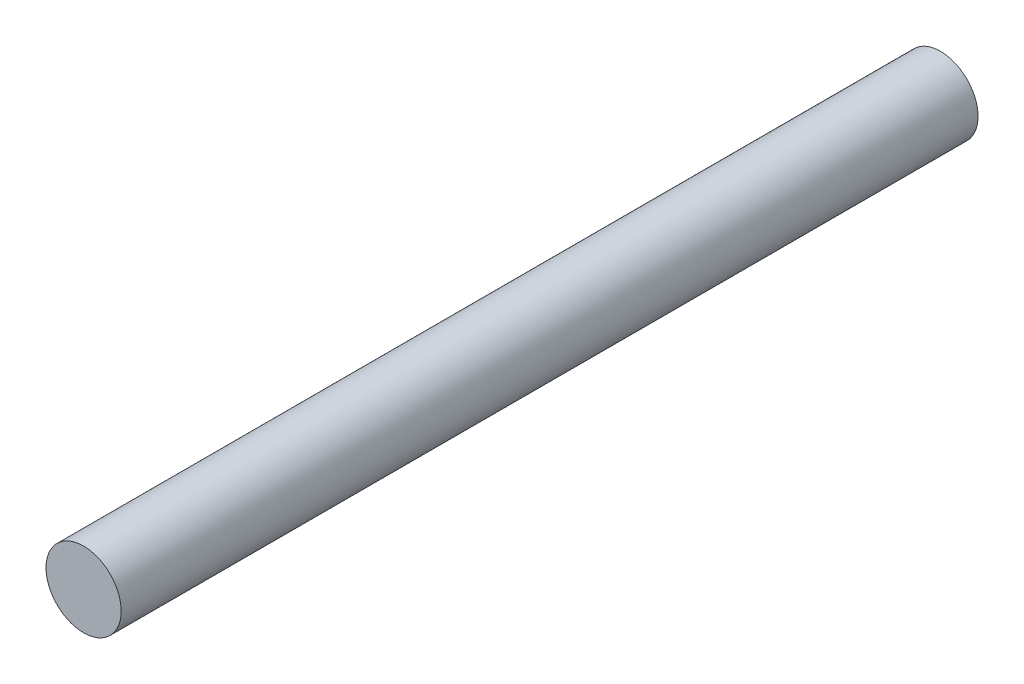
ISO-10303-21;
HEADER;
FILE_DESCRIPTION(('STEP AP214'),'2;1');
FILE_NAME('part.step','',(''),(''),'','','');
FILE_SCHEMA(('AUTOMOTIVE_DESIGN { 1 0 10303 214 1 1 1 1 }'));
ENDSEC;
DATA;
#1=APPLICATION_CONTEXT('core data for automotive mechanical design processes');
#2=APPLICATION_PROTOCOL_DEFINITION('international standard','automotive_design',2000,#1);
#3=PRODUCT_CONTEXT('',#1,'mechanical');
#4=PRODUCT('Part','Part','',(#3));
#5=PRODUCT_RELATED_PRODUCT_CATEGORY('part','',(#4));
#6=PRODUCT_DEFINITION_FORMATION('','',#4);
#7=PRODUCT_DEFINITION_CONTEXT('part definition',#1,'design');
#8=PRODUCT_DEFINITION('design','',#6,#7);
#9=PRODUCT_DEFINITION_SHAPE('','',#8);
#10=(LENGTH_UNIT() NAMED_UNIT(*) SI_UNIT(.MILLI.,.METRE.));
#11=(NAMED_UNIT(*) PLANE_ANGLE_UNIT() SI_UNIT($,.RADIAN.));
#12=(NAMED_UNIT(*) SI_UNIT($,.STERADIAN.) SOLID_ANGLE_UNIT());
#13=UNCERTAINTY_MEASURE_WITH_UNIT(LENGTH_MEASURE(1.E-05),#10,'distance_accuracy_value','');
#14=(GEOMETRIC_REPRESENTATION_CONTEXT(3) GLOBAL_UNCERTAINTY_ASSIGNED_CONTEXT((#13)) GLOBAL_UNIT_ASSIGNED_CONTEXT((#10,
#11,#12)) REPRESENTATION_CONTEXT('',''));
#15=CARTESIAN_POINT('',(0.,0.,0.));
#16=DIRECTION('',(0.,0.,1.));
#17=DIRECTION('',(1.,0.,0.));
#18=AXIS2_PLACEMENT_3D('',#15,#16,#17);
#19=CARTESIAN_POINT('',(0.,0.,57.));
#20=DIRECTION('',(0.,0.,-1.));
#21=DIRECTION('',(-1.,0.,0.));
#22=AXIS2_PLACEMENT_3D('',#19,#20,#21);
#23=CYLINDRICAL_SURFACE('',#22,2.5);
#24=CARTESIAN_POINT('',(0.,0.,57.));
#25=DIRECTION('',(0.,0.,1.));
#26=DIRECTION('',(1.,0.,0.));
#27=AXIS2_PLACEMENT_3D('',#24,#25,#26);
#28=CIRCLE('',#27,2.5);
#29=CARTESIAN_POINT('',(-2.5,0.,57.));
#30=VERTEX_POINT('',#29);
#31=EDGE_CURVE('E10',#30,#30,#28,.T.);
#32=CARTESIAN_POINT('',(0.,0.,0.));
#33=DIRECTION('',(0.,0.,1.));
#34=DIRECTION('',(1.,0.,0.));
#35=AXIS2_PLACEMENT_3D('',#32,#33,#34);
#36=CIRCLE('',#35,2.5);
#37=CARTESIAN_POINT('',(-2.5,0.,0.));
#38=VERTEX_POINT('',#37);
#39=EDGE_CURVE('E32',#38,#38,#36,.T.);
#40=CARTESIAN_POINT('',(-2.5,0.,57.));
#41=CARTESIAN_POINT('',(-2.5,0.,56.40625));
#42=CARTESIAN_POINT('',(-2.5,0.,55.8125));
#43=CARTESIAN_POINT('',(-2.5,0.,54.625));
#44=CARTESIAN_POINT('',(-2.5,0.,54.03125));
#45=CARTESIAN_POINT('',(-2.5,0.,52.84375));
#46=CARTESIAN_POINT('',(-2.5,0.,52.25));
#47=CARTESIAN_POINT('',(-2.5,0.,51.0625));
#48=CARTESIAN_POINT('',(-2.5,0.,50.46875));
#49=CARTESIAN_POINT('',(-2.5,0.,49.28125));
#50=CARTESIAN_POINT('',(-2.5,0.,48.6875));
#51=CARTESIAN_POINT('',(-2.5,0.,47.5));
#52=CARTESIAN_POINT('',(-2.5,0.,46.90625));
#53=CARTESIAN_POINT('',(-2.5,0.,45.71875));
#54=CARTESIAN_POINT('',(-2.5,0.,45.125));
#55=CARTESIAN_POINT('',(-2.5,0.,43.9375));
#56=CARTESIAN_POINT('',(-2.5,0.,43.34375));
#57=CARTESIAN_POINT('',(-2.5,0.,42.15625));
#58=CARTESIAN_POINT('',(-2.5,0.,41.5625));
#59=CARTESIAN_POINT('',(-2.5,0.,40.375));
#60=CARTESIAN_POINT('',(-2.5,0.,39.78125));
#61=CARTESIAN_POINT('',(-2.5,0.,38.59375));
#62=CARTESIAN_POINT('',(-2.5,0.,38.));
#63=CARTESIAN_POINT('',(-2.5,0.,36.8125));
#64=CARTESIAN_POINT('',(-2.5,0.,36.21875));
#65=CARTESIAN_POINT('',(-2.5,0.,35.03125));
#66=CARTESIAN_POINT('',(-2.5,0.,34.4375));
#67=CARTESIAN_POINT('',(-2.5,0.,33.25));
#68=CARTESIAN_POINT('',(-2.5,0.,32.65625));
#69=CARTESIAN_POINT('',(-2.5,0.,31.46875));
#70=CARTESIAN_POINT('',(-2.5,0.,30.875));
#71=CARTESIAN_POINT('',(-2.5,0.,29.6875));
#72=CARTESIAN_POINT('',(-2.5,0.,29.09375));
#73=CARTESIAN_POINT('',(-2.5,0.,27.90625));
#74=CARTESIAN_POINT('',(-2.5,0.,27.3125));
#75=CARTESIAN_POINT('',(-2.5,0.,26.125));
#76=CARTESIAN_POINT('',(-2.5,0.,25.53125));
#77=CARTESIAN_POINT('',(-2.5,0.,24.34375));
#78=CARTESIAN_POINT('',(-2.5,0.,23.75));
#79=CARTESIAN_POINT('',(-2.5,0.,22.5625));
#80=CARTESIAN_POINT('',(-2.5,0.,21.96875));
#81=CARTESIAN_POINT('',(-2.5,0.,20.78125));
#82=CARTESIAN_POINT('',(-2.5,0.,20.1875));
#83=CARTESIAN_POINT('',(-2.5,0.,19.));
#84=CARTESIAN_POINT('',(-2.5,0.,18.40625));
#85=CARTESIAN_POINT('',(-2.5,0.,17.21875));
#86=CARTESIAN_POINT('',(-2.5,0.,16.625));
#87=CARTESIAN_POINT('',(-2.5,0.,15.4375));
#88=CARTESIAN_POINT('',(-2.5,0.,14.84375));
#89=CARTESIAN_POINT('',(-2.5,0.,13.65625));
#90=CARTESIAN_POINT('',(-2.5,0.,13.0625));
#91=CARTESIAN_POINT('',(-2.5,0.,11.875));
#92=CARTESIAN_POINT('',(-2.5,0.,11.28125));
#93=CARTESIAN_POINT('',(-2.5,0.,10.09375));
#94=CARTESIAN_POINT('',(-2.5,0.,9.5));
#95=CARTESIAN_POINT('',(-2.5,0.,8.3125));
#96=CARTESIAN_POINT('',(-2.5,0.,7.71875));
#97=CARTESIAN_POINT('',(-2.5,0.,6.53125));
#98=CARTESIAN_POINT('',(-2.5,0.,5.9375));
#99=CARTESIAN_POINT('',(-2.5,0.,4.75));
#100=CARTESIAN_POINT('',(-2.5,0.,4.15625));
#101=CARTESIAN_POINT('',(-2.5,0.,2.96875));
#102=CARTESIAN_POINT('',(-2.5,0.,2.375));
#103=CARTESIAN_POINT('',(-2.5,0.,1.1875));
#104=CARTESIAN_POINT('',(-2.5,0.,0.593749999999999));
#105=CARTESIAN_POINT('',(-2.5,0.,0.));
#106=B_SPLINE_CURVE_WITH_KNOTS('',3,(#40,#41,#42,#43,#44,#45,#46,#47,#48,#49,#50,#51,#52,#53,
#54,#55,#56,#57,#58,#59,#60,#61,#62,#63,#64,#65,#66,#67,#68,#69,#70,#71,#72,#73,#74,#75,#76,#77,
#78,#79,#80,#81,#82,#83,#84,#85,#86,#87,#88,#89,#90,#91,#92,#93,#94,#95,#96,#97,#98,#99,#100,
#101,#102,#103,#104,#105),.UNSPECIFIED.,.F.,.F.,(4,2,2,2,2,2,2,2,2,2,2,2,2,2,2,2,2,2,2,2,2,2,2,
2,2,2,2,2,2,2,2,2,4),(0.,1.78125000000001,3.5625,5.34375,7.12500000000001,8.90625,10.6875,
12.46875,14.25,16.03125,17.8125,19.59375,21.375,23.15625,24.9375,26.71875,28.5,30.28125,32.0625,
33.84375,35.625,37.40625,39.1875,40.96875,42.75,44.53125,46.3125,48.09375,49.875,51.65625,
53.4375,55.21875,57.),.UNSPECIFIED.);
#107=EDGE_CURVE('BSEAM29',#30,#38,#106,.T.);
#108=ORIENTED_EDGE('',*,*,#31,.F.);
#109=ORIENTED_EDGE('',*,*,#39,.T.);
#110=ORIENTED_EDGE('',*,*,#107,.T.);
#111=ORIENTED_EDGE('',*,*,#107,.F.);
#112=EDGE_LOOP('',(#108,#110,#109,#111));
#113=FACE_BOUND('',#112,.T.);
#114=ADVANCED_FACE('F29',(#113),#23,.T.);
#115=CARTESIAN_POINT('',(0.,0.,57.));
#116=DIRECTION('',(0.,0.,1.));
#117=DIRECTION('',(1.,0.,0.));
#118=AXIS2_PLACEMENT_3D('',#115,#116,#117);
#119=PLANE('',#118);
#120=ORIENTED_EDGE('',*,*,#31,.T.);
#121=EDGE_LOOP('',(#120));
#122=FACE_BOUND('',#121,.T.);
#123=ADVANCED_FACE('F44',(#122),#119,.T.);
#124=CARTESIAN_POINT('',(0.,0.,0.));
#125=DIRECTION('',(0.,0.,1.));
#126=DIRECTION('',(1.,0.,0.));
#127=AXIS2_PLACEMENT_3D('',#124,#125,#126);
#128=PLANE('',#127);
#129=ORIENTED_EDGE('',*,*,#39,.F.);
#130=EDGE_LOOP('',(#129));
#131=FACE_BOUND('',#130,.T.);
#132=ADVANCED_FACE('F42',(#131),#128,.F.);
#133=CLOSED_SHELL('',(#114,#123,#132));
#134=MANIFOLD_SOLID_BREP('B2',#133);
#135=ADVANCED_BREP_SHAPE_REPRESENTATION('',(#18,#134),#14);
#136=SHAPE_DEFINITION_REPRESENTATION(#9,#135);
ENDSEC;
END-ISO-10303-21;
